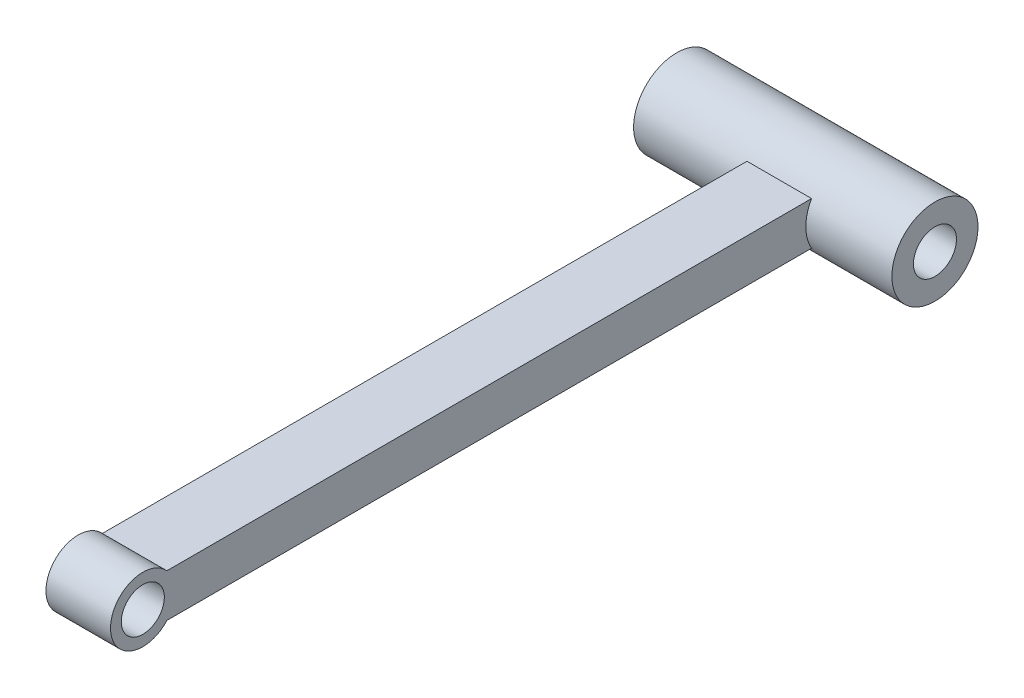
ISO-10303-21;
HEADER;
FILE_DESCRIPTION(('STEP AP214'),'2;1');
FILE_NAME('part.step','',(''),(''),'','','');
FILE_SCHEMA(('AUTOMOTIVE_DESIGN { 1 0 10303 214 1 1 1 1 }'));
ENDSEC;
DATA;
#1=APPLICATION_CONTEXT('core data for automotive mechanical design processes');
#2=APPLICATION_PROTOCOL_DEFINITION('international standard','automotive_design',2000,#1);
#3=PRODUCT_CONTEXT('',#1,'mechanical');
#4=PRODUCT('Part','Part','',(#3));
#5=PRODUCT_RELATED_PRODUCT_CATEGORY('part','',(#4));
#6=PRODUCT_DEFINITION_FORMATION('','',#4);
#7=PRODUCT_DEFINITION_CONTEXT('part definition',#1,'design');
#8=PRODUCT_DEFINITION('design','',#6,#7);
#9=PRODUCT_DEFINITION_SHAPE('','',#8);
#10=(LENGTH_UNIT() NAMED_UNIT(*) SI_UNIT(.MILLI.,.METRE.));
#11=(NAMED_UNIT(*) PLANE_ANGLE_UNIT() SI_UNIT($,.RADIAN.));
#12=(NAMED_UNIT(*) SI_UNIT($,.STERADIAN.) SOLID_ANGLE_UNIT());
#13=UNCERTAINTY_MEASURE_WITH_UNIT(LENGTH_MEASURE(1.E-05),#10,'distance_accuracy_value','');
#14=(GEOMETRIC_REPRESENTATION_CONTEXT(3) GLOBAL_UNCERTAINTY_ASSIGNED_CONTEXT((#13)) GLOBAL_UNIT_ASSIGNED_CONTEXT((#10,
#11,#12)) REPRESENTATION_CONTEXT('',''));
#15=CARTESIAN_POINT('',(0.,0.,0.));
#16=DIRECTION('',(0.,0.,1.));
#17=DIRECTION('',(1.,0.,0.));
#18=AXIS2_PLACEMENT_3D('',#15,#16,#17);
#19=CARTESIAN_POINT('',(40.,-5.00000000000001,0.));
#20=DIRECTION('',(0.,1.,0.));
#21=DIRECTION('',(0.,0.,1.));
#22=AXIS2_PLACEMENT_3D('',#19,#20,#21);
#23=PLANE('',#22);
#24=DIRECTION('',(0.,0.,-1.));
#25=VECTOR('',#24,1.);
#26=CARTESIAN_POINT('',(25.,-5.00000000000001,0.));
#27=LINE('',#26,#25);
#28=CARTESIAN_POINT('',(25.,-5.,158.409830056251));
#29=VERTEX_POINT('',#28);
#30=CARTESIAN_POINT('',(25.,-5.00000000000001,8.66025403784438));
#31=VERTEX_POINT('',#30);
#32=EDGE_CURVE('E116',#29,#31,#27,.T.);
#33=ORIENTED_EDGE('',*,*,#32,.T.);
#34=DIRECTION('',(-1.,0.,0.));
#35=VECTOR('',#34,1.);
#36=CARTESIAN_POINT('',(40.,-5.00000000000001,8.66025403784438));
#37=LINE('',#36,#35);
#38=CARTESIAN_POINT('',(40.,-5.00000000000001,8.66025403784438));
#39=VERTEX_POINT('',#38);
#40=EDGE_CURVE('E12',#39,#31,#37,.T.);
#41=ORIENTED_EDGE('',*,*,#40,.F.);
#42=DIRECTION('',(0.,0.,-1.));
#43=VECTOR('',#42,1.);
#44=CARTESIAN_POINT('',(40.,-5.00000000000001,0.));
#45=LINE('',#44,#43);
#46=CARTESIAN_POINT('',(40.,-5.,158.409830056251));
#47=VERTEX_POINT('',#46);
#48=EDGE_CURVE('E106',#47,#39,#45,.T.);
#49=ORIENTED_EDGE('',*,*,#48,.F.);
#50=DIRECTION('',(-1.,0.,0.));
#51=VECTOR('',#50,1.);
#52=CARTESIAN_POINT('',(40.,-5.,158.409830056251));
#53=LINE('',#52,#51);
#54=EDGE_CURVE('E50',#47,#29,#53,.T.);
#55=ORIENTED_EDGE('',*,*,#54,.T.);
#56=EDGE_LOOP('',(#33,#41,#49,#55));
#57=FACE_BOUND('',#56,.T.);
#58=ADVANCED_FACE('F46',(#57),#23,.F.);
#59=CARTESIAN_POINT('',(40.,0.,0.));
#60=DIRECTION('',(-1.,0.,0.));
#61=DIRECTION('',(0.,0.,1.));
#62=AXIS2_PLACEMENT_3D('',#59,#60,#61);
#63=CYLINDRICAL_SURFACE('',#62,10.);
#64=CARTESIAN_POINT('',(25.,0.,0.));
#65=DIRECTION('',(-1.,0.,0.));
#66=DIRECTION('',(0.,0.,1.));
#67=AXIS2_PLACEMENT_3D('',#64,#65,#66);
#68=CIRCLE('',#67,10.);
#69=CARTESIAN_POINT('',(25.,5.00000000000001,8.66025403784438));
#70=VERTEX_POINT('',#69);
#71=EDGE_CURVE('E86',#31,#70,#68,.T.);
#72=ORIENTED_EDGE('',*,*,#71,.T.);
#73=DIRECTION('',(-1.,0.,0.));
#74=VECTOR('',#73,1.);
#75=CARTESIAN_POINT('',(40.,5.00000000000001,8.66025403784438));
#76=LINE('',#75,#74);
#77=CARTESIAN_POINT('',(40.,5.00000000000001,8.66025403784438));
#78=VERTEX_POINT('',#77);
#79=EDGE_CURVE('E56',#78,#70,#76,.T.);
#80=ORIENTED_EDGE('',*,*,#79,.F.);
#81=CARTESIAN_POINT('',(40.,0.,0.));
#82=DIRECTION('',(-1.,0.,0.));
#83=DIRECTION('',(0.,0.,1.));
#84=AXIS2_PLACEMENT_3D('',#81,#82,#83);
#85=CIRCLE('',#84,10.);
#86=EDGE_CURVE('E64',#39,#78,#85,.T.);
#87=ORIENTED_EDGE('',*,*,#86,.F.);
#88=ORIENTED_EDGE('',*,*,#40,.T.);
#89=EDGE_LOOP('',(#72,#80,#87,#88));
#90=FACE_BOUND('',#89,.T.);
#91=ADVANCED_FACE('F136',(#90),#63,.F.);
#92=CARTESIAN_POINT('',(40.,5.00000000000001,0.));
#93=DIRECTION('',(0.,1.,0.));
#94=DIRECTION('',(0.,0.,1.));
#95=AXIS2_PLACEMENT_3D('',#92,#93,#94);
#96=PLANE('',#95);
#97=DIRECTION('',(0.,0.,-1.));
#98=VECTOR('',#97,1.);
#99=CARTESIAN_POINT('',(25.,5.00000000000001,0.));
#100=LINE('',#99,#98);
#101=CARTESIAN_POINT('',(25.,5.,158.409830056251));
#102=VERTEX_POINT('',#101);
#103=EDGE_CURVE('E98',#102,#70,#100,.T.);
#104=ORIENTED_EDGE('',*,*,#103,.F.);
#105=DIRECTION('',(-1.,0.,0.));
#106=VECTOR('',#105,1.);
#107=CARTESIAN_POINT('',(40.,5.,158.409830056251));
#108=LINE('',#107,#106);
#109=CARTESIAN_POINT('',(40.,5.,158.409830056251));
#110=VERTEX_POINT('',#109);
#111=EDGE_CURVE('E94',#110,#102,#108,.T.);
#112=ORIENTED_EDGE('',*,*,#111,.F.);
#113=DIRECTION('',(0.,0.,-1.));
#114=VECTOR('',#113,1.);
#115=CARTESIAN_POINT('',(40.,5.00000000000001,0.));
#116=LINE('',#115,#114);
#117=EDGE_CURVE('E97',#110,#78,#116,.T.);
#118=ORIENTED_EDGE('',*,*,#117,.T.);
#119=ORIENTED_EDGE('',*,*,#79,.T.);
#120=EDGE_LOOP('',(#104,#112,#118,#119));
#121=FACE_BOUND('',#120,.T.);
#122=ADVANCED_FACE('F96',(#121),#96,.T.);
#123=CARTESIAN_POINT('',(40.,0.,164.));
#124=DIRECTION('',(-1.,0.,0.));
#125=DIRECTION('',(0.,0.,1.));
#126=AXIS2_PLACEMENT_3D('',#123,#124,#125);
#127=CYLINDRICAL_SURFACE('',#126,5.00000000000002);
#128=CARTESIAN_POINT('',(40.,0.,164.));
#129=DIRECTION('',(-1.,0.,0.));
#130=DIRECTION('',(0.,0.,1.));
#131=AXIS2_PLACEMENT_3D('',#128,#129,#130);
#132=CIRCLE('',#131,5.00000000000002);
#133=CARTESIAN_POINT('',(40.,0.,169.));
#134=VERTEX_POINT('',#133);
#135=EDGE_CURVE('E108',#134,#134,#132,.T.);
#136=ORIENTED_EDGE('',*,*,#135,.F.);
#137=EDGE_LOOP('',(#136));
#138=FACE_BOUND('',#137,.T.);
#139=CARTESIAN_POINT('',(25.,0.,164.));
#140=DIRECTION('',(-1.,0.,0.));
#141=DIRECTION('',(0.,0.,1.));
#142=AXIS2_PLACEMENT_3D('',#139,#140,#141);
#143=CIRCLE('',#142,5.00000000000002);
#144=CARTESIAN_POINT('',(25.,0.,169.));
#145=VERTEX_POINT('',#144);
#146=EDGE_CURVE('E113',#145,#145,#143,.T.);
#147=ORIENTED_EDGE('',*,*,#146,.T.);
#148=EDGE_LOOP('',(#147));
#149=FACE_BOUND('',#148,.T.);
#150=ADVANCED_FACE('F48',(#138,#149),#127,.F.);
#151=CARTESIAN_POINT('',(40.,0.,164.));
#152=DIRECTION('',(-1.,0.,0.));
#153=DIRECTION('',(0.,0.,1.));
#154=AXIS2_PLACEMENT_3D('',#151,#152,#153);
#155=CYLINDRICAL_SURFACE('',#154,7.5);
#156=CARTESIAN_POINT('',(25.,0.,164.));
#157=DIRECTION('',(-1.,0.,0.));
#158=DIRECTION('',(0.,0.,1.));
#159=AXIS2_PLACEMENT_3D('',#156,#157,#158);
#160=CIRCLE('',#159,7.5);
#161=EDGE_CURVE('E119',#29,#102,#160,.T.);
#162=ORIENTED_EDGE('',*,*,#161,.F.);
#163=ORIENTED_EDGE('',*,*,#54,.F.);
#164=CARTESIAN_POINT('',(40.,0.,164.));
#165=DIRECTION('',(-1.,0.,0.));
#166=DIRECTION('',(0.,0.,1.));
#167=AXIS2_PLACEMENT_3D('',#164,#165,#166);
#168=CIRCLE('',#167,7.5);
#169=EDGE_CURVE('E103',#47,#110,#168,.T.);
#170=ORIENTED_EDGE('',*,*,#169,.T.);
#171=ORIENTED_EDGE('',*,*,#111,.T.);
#172=EDGE_LOOP('',(#162,#163,#170,#171));
#173=FACE_BOUND('',#172,.T.);
#174=ADVANCED_FACE('F105',(#173),#155,.T.);
#175=CARTESIAN_POINT('',(40.,0.,0.));
#176=DIRECTION('',(-1.,0.,0.));
#177=DIRECTION('',(0.,0.,1.));
#178=AXIS2_PLACEMENT_3D('',#175,#176,#177);
#179=PLANE('',#178);
#180=ORIENTED_EDGE('',*,*,#135,.T.);
#181=EDGE_LOOP('',(#180));
#182=FACE_BOUND('',#181,.T.);
#183=ORIENTED_EDGE('',*,*,#48,.T.);
#184=ORIENTED_EDGE('',*,*,#86,.T.);
#185=ORIENTED_EDGE('',*,*,#117,.F.);
#186=ORIENTED_EDGE('',*,*,#169,.F.);
#187=EDGE_LOOP('',(#183,#184,#185,#186));
#188=FACE_BOUND('',#187,.T.);
#189=ADVANCED_FACE('F102',(#182,#188),#179,.F.);
#190=CARTESIAN_POINT('',(25.,0.,0.));
#191=DIRECTION('',(-1.,0.,0.));
#192=DIRECTION('',(0.,0.,1.));
#193=AXIS2_PLACEMENT_3D('',#190,#191,#192);
#194=PLANE('',#193);
#195=ORIENTED_EDGE('',*,*,#146,.F.);
#196=EDGE_LOOP('',(#195));
#197=FACE_BOUND('',#196,.T.);
#198=ORIENTED_EDGE('',*,*,#32,.F.);
#199=ORIENTED_EDGE('',*,*,#161,.T.);
#200=ORIENTED_EDGE('',*,*,#103,.T.);
#201=ORIENTED_EDGE('',*,*,#71,.F.);
#202=EDGE_LOOP('',(#198,#199,#200,#201));
#203=FACE_BOUND('',#202,.T.);
#204=ADVANCED_FACE('F131',(#197,#203),#194,.T.);
#205=CLOSED_SHELL('',(#58,#91,#122,#150,#174,#189,#204));
#206=MANIFOLD_SOLID_BREP('B2',#205);
#207=CARTESIAN_POINT('',(60.,0.,0.));
#208=DIRECTION('',(1.,0.,0.));
#209=DIRECTION('',(0.,0.,-1.));
#210=AXIS2_PLACEMENT_3D('',#207,#208,#209);
#211=PLANE('',#210);
#212=CARTESIAN_POINT('',(60.,0.,0.));
#213=DIRECTION('',(1.,0.,0.));
#214=DIRECTION('',(0.,0.,-1.));
#215=AXIS2_PLACEMENT_3D('',#212,#213,#214);
#216=CIRCLE('',#215,10.);
#217=CARTESIAN_POINT('',(60.,0.,-10.));
#218=VERTEX_POINT('',#217);
#219=EDGE_CURVE('E45',#218,#218,#216,.T.);
#220=ORIENTED_EDGE('',*,*,#219,.T.);
#221=EDGE_LOOP('',(#220));
#222=FACE_BOUND('',#221,.T.);
#223=CARTESIAN_POINT('',(60.,0.,0.));
#224=DIRECTION('',(1.,0.,0.));
#225=DIRECTION('',(0.,0.,-1.));
#226=AXIS2_PLACEMENT_3D('',#223,#224,#225);
#227=CIRCLE('',#226,5.);
#228=CARTESIAN_POINT('',(60.,0.,-5.));
#229=VERTEX_POINT('',#228);
#230=EDGE_CURVE('E215',#229,#229,#227,.T.);
#231=ORIENTED_EDGE('',*,*,#230,.F.);
#232=EDGE_LOOP('',(#231));
#233=FACE_BOUND('',#232,.T.);
#234=ADVANCED_FACE('F204',(#222,#233),#211,.T.);
#235=CARTESIAN_POINT('',(0.,0.,0.));
#236=DIRECTION('',(1.,0.,0.));
#237=DIRECTION('',(0.,0.,-1.));
#238=AXIS2_PLACEMENT_3D('',#235,#236,#237);
#239=PLANE('',#238);
#240=CARTESIAN_POINT('',(0.,0.,0.));
#241=DIRECTION('',(1.,0.,0.));
#242=DIRECTION('',(0.,0.,-1.));
#243=AXIS2_PLACEMENT_3D('',#240,#241,#242);
#244=CIRCLE('',#243,10.);
#245=CARTESIAN_POINT('',(0.,0.,-10.));
#246=VERTEX_POINT('',#245);
#247=EDGE_CURVE('E208',#246,#246,#244,.T.);
#248=ORIENTED_EDGE('',*,*,#247,.F.);
#249=EDGE_LOOP('',(#248));
#250=FACE_BOUND('',#249,.T.);
#251=CARTESIAN_POINT('',(0.,0.,0.));
#252=DIRECTION('',(1.,0.,0.));
#253=DIRECTION('',(0.,0.,-1.));
#254=AXIS2_PLACEMENT_3D('',#251,#252,#253);
#255=CIRCLE('',#254,5.);
#256=CARTESIAN_POINT('',(0.,0.,-5.));
#257=VERTEX_POINT('',#256);
#258=EDGE_CURVE('E217',#257,#257,#255,.T.);
#259=ORIENTED_EDGE('',*,*,#258,.T.);
#260=EDGE_LOOP('',(#259));
#261=FACE_BOUND('',#260,.T.);
#262=ADVANCED_FACE('F227',(#250,#261),#239,.F.);
#263=CARTESIAN_POINT('',(60.,0.,0.));
#264=DIRECTION('',(-1.,0.,0.));
#265=DIRECTION('',(0.,0.,1.));
#266=AXIS2_PLACEMENT_3D('',#263,#264,#265);
#267=CYLINDRICAL_SURFACE('',#266,10.);
#268=ORIENTED_EDGE('',*,*,#219,.F.);
#269=EDGE_LOOP('',(#268));
#270=FACE_BOUND('',#269,.T.);
#271=ORIENTED_EDGE('',*,*,#247,.T.);
#272=EDGE_LOOP('',(#271));
#273=FACE_BOUND('',#272,.T.);
#274=ADVANCED_FACE('F206',(#270,#273),#267,.T.);
#275=CARTESIAN_POINT('',(60.,0.,0.));
#276=DIRECTION('',(-1.,0.,0.));
#277=DIRECTION('',(0.,0.,1.));
#278=AXIS2_PLACEMENT_3D('',#275,#276,#277);
#279=CYLINDRICAL_SURFACE('',#278,5.);
#280=ORIENTED_EDGE('',*,*,#230,.T.);
#281=EDGE_LOOP('',(#280));
#282=FACE_BOUND('',#281,.T.);
#283=ORIENTED_EDGE('',*,*,#258,.F.);
#284=EDGE_LOOP('',(#283));
#285=FACE_BOUND('',#284,.T.);
#286=ADVANCED_FACE('F223',(#282,#285),#279,.F.);
#287=CLOSED_SHELL('',(#234,#262,#274,#286));
#288=MANIFOLD_SOLID_BREP('B6',#287);
#289=ADVANCED_BREP_SHAPE_REPRESENTATION('',(#18,#206,#288),#14);
#290=SHAPE_DEFINITION_REPRESENTATION(#9,#289);
ENDSEC;
END-ISO-10303-21;
